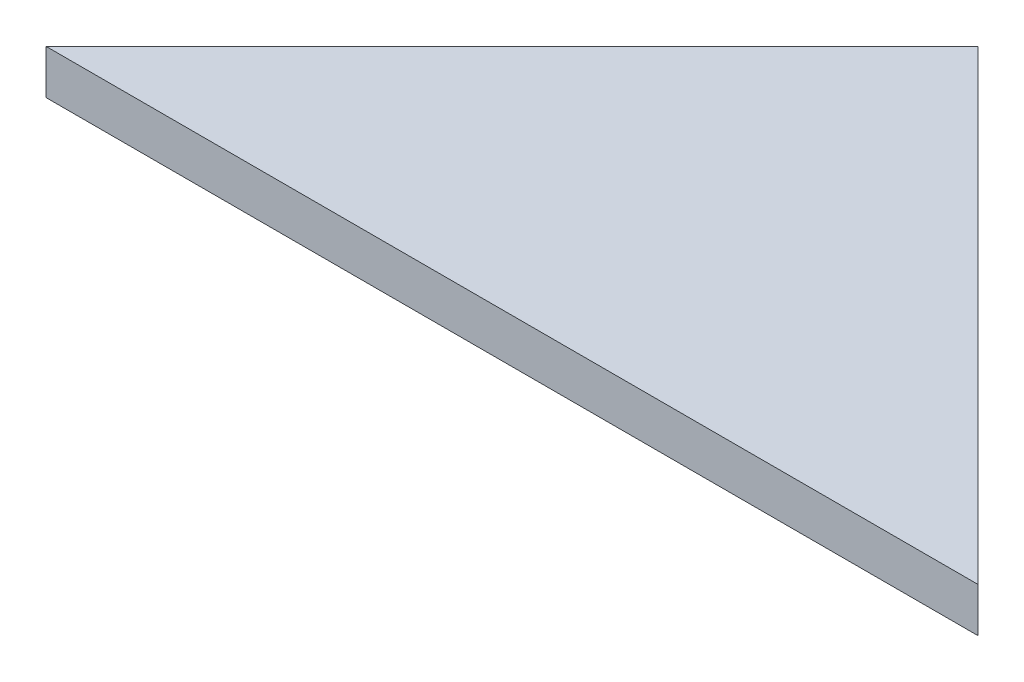
ISO-10303-21;
HEADER;
FILE_DESCRIPTION(('STEP AP214'),'2;1');
FILE_NAME('part.step','',(''),(''),'','','');
FILE_SCHEMA(('AUTOMOTIVE_DESIGN { 1 0 10303 214 1 1 1 1 }'));
ENDSEC;
DATA;
#1=APPLICATION_CONTEXT('core data for automotive mechanical design processes');
#2=APPLICATION_PROTOCOL_DEFINITION('international standard','automotive_design',2000,#1);
#3=PRODUCT_CONTEXT('',#1,'mechanical');
#4=PRODUCT('Part','Part','',(#3));
#5=PRODUCT_RELATED_PRODUCT_CATEGORY('part','',(#4));
#6=PRODUCT_DEFINITION_FORMATION('','',#4);
#7=PRODUCT_DEFINITION_CONTEXT('part definition',#1,'design');
#8=PRODUCT_DEFINITION('design','',#6,#7);
#9=PRODUCT_DEFINITION_SHAPE('','',#8);
#10=(LENGTH_UNIT() NAMED_UNIT(*) SI_UNIT(.MILLI.,.METRE.));
#11=(NAMED_UNIT(*) PLANE_ANGLE_UNIT() SI_UNIT($,.RADIAN.));
#12=(NAMED_UNIT(*) SI_UNIT($,.STERADIAN.) SOLID_ANGLE_UNIT());
#13=UNCERTAINTY_MEASURE_WITH_UNIT(LENGTH_MEASURE(1.E-05),#10,'distance_accuracy_value','');
#14=(GEOMETRIC_REPRESENTATION_CONTEXT(3) GLOBAL_UNCERTAINTY_ASSIGNED_CONTEXT((#13)) GLOBAL_UNIT_ASSIGNED_CONTEXT((#10,
#11,#12)) REPRESENTATION_CONTEXT('',''));
#15=CARTESIAN_POINT('',(0.,0.,0.));
#16=DIRECTION('',(0.,0.,1.));
#17=DIRECTION('',(1.,0.,0.));
#18=AXIS2_PLACEMENT_3D('',#15,#16,#17);
#19=CARTESIAN_POINT('',(0.,233.131797749979,-100.));
#20=DIRECTION('',(0.707106781186548,0.,0.707106781186548));
#21=DIRECTION('',(0.707106781186547,0.,-0.707106781186548));
#22=AXIS2_PLACEMENT_3D('',#19,#20,#21);
#23=PLANE('',#22);
#24=DIRECTION('',(-0.707106781186547,0.,0.707106781186548));
#25=VECTOR('',#24,1.);
#26=CARTESIAN_POINT('',(0.,9.52500000000001,-100.));
#27=LINE('',#26,#25);
#28=CARTESIAN_POINT('',(0.,9.52500000000001,-100.));
#29=VERTEX_POINT('',#28);
#30=CARTESIAN_POINT('',(-100.,9.52500000000001,0.));
#31=VERTEX_POINT('',#30);
#32=EDGE_CURVE('E42',#29,#31,#27,.T.);
#33=ORIENTED_EDGE('',*,*,#32,.F.);
#34=DIRECTION('',(0.,-1.,0.));
#35=VECTOR('',#34,1.);
#36=CARTESIAN_POINT('',(0.,233.131797749979,-100.));
#37=LINE('',#36,#35);
#38=CARTESIAN_POINT('',(0.,0.,-100.));
#39=VERTEX_POINT('',#38);
#40=EDGE_CURVE('E37',#29,#39,#37,.T.);
#41=ORIENTED_EDGE('',*,*,#40,.T.);
#42=DIRECTION('',(-0.707106781186547,0.,0.707106781186548));
#43=VECTOR('',#42,1.);
#44=CARTESIAN_POINT('',(0.,0.,-100.));
#45=LINE('',#44,#43);
#46=CARTESIAN_POINT('',(-100.,0.,0.));
#47=VERTEX_POINT('',#46);
#48=EDGE_CURVE('E72',#39,#47,#45,.T.);
#49=ORIENTED_EDGE('',*,*,#48,.T.);
#50=DIRECTION('',(0.,-1.,0.));
#51=VECTOR('',#50,1.);
#52=CARTESIAN_POINT('',(-100.,233.131797749979,0.));
#53=LINE('',#52,#51);
#54=EDGE_CURVE('E67',#31,#47,#53,.T.);
#55=ORIENTED_EDGE('',*,*,#54,.F.);
#56=EDGE_LOOP('',(#33,#41,#49,#55));
#57=FACE_BOUND('',#56,.T.);
#58=ADVANCED_FACE('F33',(#57),#23,.F.);
#59=CARTESIAN_POINT('',(-100.,233.131797749979,0.));
#60=DIRECTION('',(0.,0.,-1.));
#61=DIRECTION('',(-1.,0.,0.));
#62=AXIS2_PLACEMENT_3D('',#59,#60,#61);
#63=PLANE('',#62);
#64=DIRECTION('',(1.,0.,0.));
#65=VECTOR('',#64,1.);
#66=CARTESIAN_POINT('',(-100.,9.52500000000001,0.));
#67=LINE('',#66,#65);
#68=CARTESIAN_POINT('',(100.,9.52500000000001,0.));
#69=VERTEX_POINT('',#68);
#70=EDGE_CURVE('E11',#31,#69,#67,.T.);
#71=ORIENTED_EDGE('',*,*,#70,.F.);
#72=ORIENTED_EDGE('',*,*,#54,.T.);
#73=DIRECTION('',(1.,0.,0.));
#74=VECTOR('',#73,1.);
#75=CARTESIAN_POINT('',(-100.,0.,0.));
#76=LINE('',#75,#74);
#77=CARTESIAN_POINT('',(100.,0.,0.));
#78=VERTEX_POINT('',#77);
#79=EDGE_CURVE('E82',#47,#78,#76,.T.);
#80=ORIENTED_EDGE('',*,*,#79,.T.);
#81=DIRECTION('',(0.,-1.,0.));
#82=VECTOR('',#81,1.);
#83=CARTESIAN_POINT('',(100.,233.131797749979,0.));
#84=LINE('',#83,#82);
#85=EDGE_CURVE('E55',#69,#78,#84,.T.);
#86=ORIENTED_EDGE('',*,*,#85,.F.);
#87=EDGE_LOOP('',(#71,#72,#80,#86));
#88=FACE_BOUND('',#87,.T.);
#89=ADVANCED_FACE('F88',(#88),#63,.F.);
#90=CARTESIAN_POINT('',(100.,233.131797749979,0.));
#91=DIRECTION('',(-0.707106781186547,0.,0.707106781186548));
#92=DIRECTION('',(0.707106781186548,0.,0.707106781186547));
#93=AXIS2_PLACEMENT_3D('',#90,#91,#92);
#94=PLANE('',#93);
#95=DIRECTION('',(-0.707106781186548,0.,-0.707106781186547));
#96=VECTOR('',#95,1.);
#97=CARTESIAN_POINT('',(100.,9.52500000000001,0.));
#98=LINE('',#97,#96);
#99=EDGE_CURVE('E79',#69,#29,#98,.T.);
#100=ORIENTED_EDGE('',*,*,#99,.F.);
#101=ORIENTED_EDGE('',*,*,#85,.T.);
#102=DIRECTION('',(-0.707106781186548,0.,-0.707106781186547));
#103=VECTOR('',#102,1.);
#104=CARTESIAN_POINT('',(100.,0.,0.));
#105=LINE('',#104,#103);
#106=EDGE_CURVE('E76',#78,#39,#105,.T.);
#107=ORIENTED_EDGE('',*,*,#106,.T.);
#108=ORIENTED_EDGE('',*,*,#40,.F.);
#109=EDGE_LOOP('',(#100,#101,#107,#108));
#110=FACE_BOUND('',#109,.T.);
#111=ADVANCED_FACE('F77',(#110),#94,.F.);
#112=CARTESIAN_POINT('',(0.,0.,0.));
#113=DIRECTION('',(0.,-1.,0.));
#114=DIRECTION('',(0.,0.,-1.));
#115=AXIS2_PLACEMENT_3D('',#112,#113,#114);
#116=PLANE('',#115);
#117=ORIENTED_EDGE('',*,*,#48,.F.);
#118=ORIENTED_EDGE('',*,*,#106,.F.);
#119=ORIENTED_EDGE('',*,*,#79,.F.);
#120=EDGE_LOOP('',(#117,#118,#119));
#121=FACE_BOUND('',#120,.T.);
#122=ADVANCED_FACE('F81',(#121),#116,.T.);
#123=CARTESIAN_POINT('',(0.,9.525,0.));
#124=DIRECTION('',(0.,1.,0.));
#125=DIRECTION('',(0.,0.,1.));
#126=AXIS2_PLACEMENT_3D('',#123,#124,#125);
#127=PLANE('',#126);
#128=ORIENTED_EDGE('',*,*,#99,.T.);
#129=ORIENTED_EDGE('',*,*,#32,.T.);
#130=ORIENTED_EDGE('',*,*,#70,.T.);
#131=EDGE_LOOP('',(#128,#129,#130));
#132=FACE_BOUND('',#131,.T.);
#133=ADVANCED_FACE('F35',(#132),#127,.T.);
#134=CLOSED_SHELL('',(#58,#89,#111,#122,#133));
#135=MANIFOLD_SOLID_BREP('B2',#134);
#136=ADVANCED_BREP_SHAPE_REPRESENTATION('',(#18,#135),#14);
#137=SHAPE_DEFINITION_REPRESENTATION(#9,#136);
ENDSEC;
END-ISO-10303-21;
